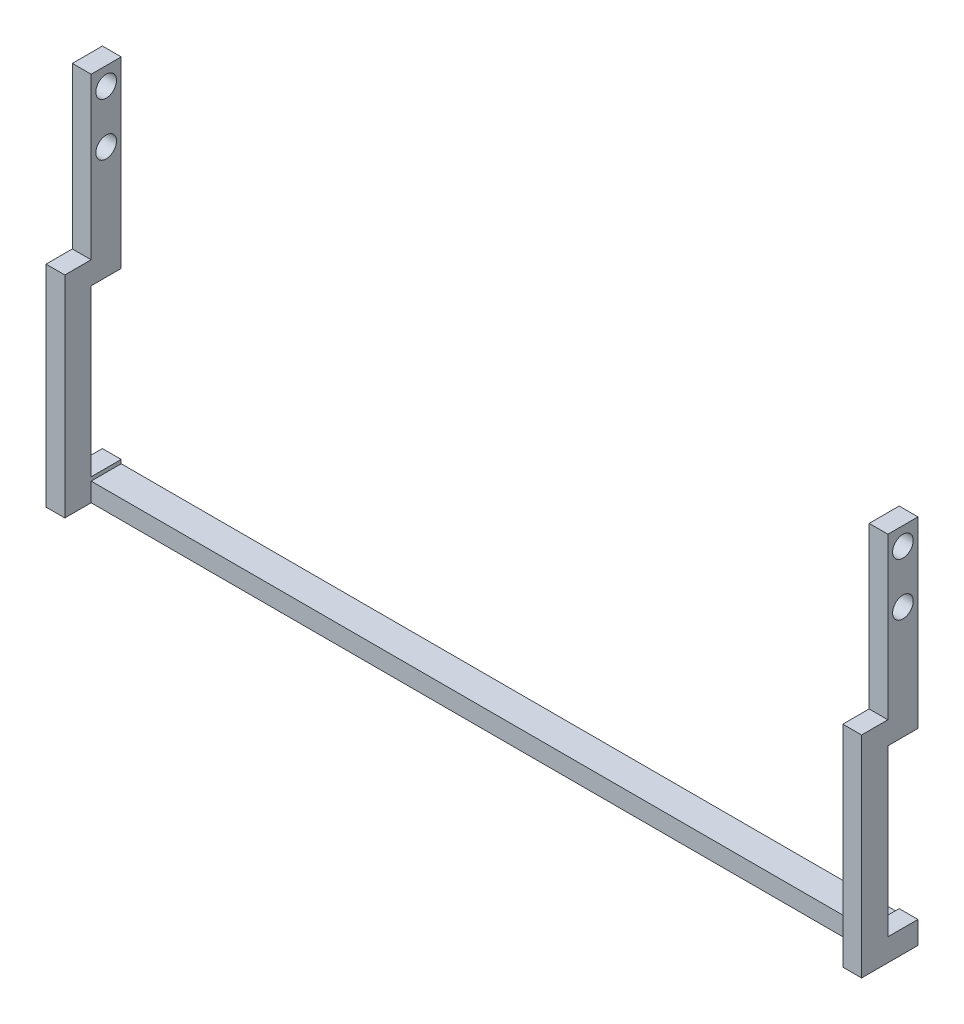
ISO-10303-21;
HEADER;
FILE_DESCRIPTION(('STEP AP214'),'2;1');
FILE_NAME('part.step','',(''),(''),'','','');
FILE_SCHEMA(('AUTOMOTIVE_DESIGN { 1 0 10303 214 1 1 1 1 }'));
ENDSEC;
DATA;
#1=APPLICATION_CONTEXT('core data for automotive mechanical design processes');
#2=APPLICATION_PROTOCOL_DEFINITION('international standard','automotive_design',2000,#1);
#3=PRODUCT_CONTEXT('',#1,'mechanical');
#4=PRODUCT('Part','Part','',(#3));
#5=PRODUCT_RELATED_PRODUCT_CATEGORY('part','',(#4));
#6=PRODUCT_DEFINITION_FORMATION('','',#4);
#7=PRODUCT_DEFINITION_CONTEXT('part definition',#1,'design');
#8=PRODUCT_DEFINITION('design','',#6,#7);
#9=PRODUCT_DEFINITION_SHAPE('','',#8);
#10=(LENGTH_UNIT() NAMED_UNIT(*) SI_UNIT(.MILLI.,.METRE.));
#11=(NAMED_UNIT(*) PLANE_ANGLE_UNIT() SI_UNIT($,.RADIAN.));
#12=(NAMED_UNIT(*) SI_UNIT($,.STERADIAN.) SOLID_ANGLE_UNIT());
#13=UNCERTAINTY_MEASURE_WITH_UNIT(LENGTH_MEASURE(1.E-05),#10,'distance_accuracy_value','');
#14=(GEOMETRIC_REPRESENTATION_CONTEXT(3) GLOBAL_UNCERTAINTY_ASSIGNED_CONTEXT((#13)) GLOBAL_UNIT_ASSIGNED_CONTEXT((#10,
#11,#12)) REPRESENTATION_CONTEXT('',''));
#15=CARTESIAN_POINT('',(0.,0.,0.));
#16=DIRECTION('',(0.,0.,1.));
#17=DIRECTION('',(1.,0.,0.));
#18=AXIS2_PLACEMENT_3D('',#15,#16,#17);
#19=CARTESIAN_POINT('',(1016.645,222.325841887961,59.6040827323368));
#20=DIRECTION('',(0.,0.,-1.));
#21=DIRECTION('',(-1.,0.,0.));
#22=AXIS2_PLACEMENT_3D('',#19,#20,#21);
#23=PLANE('',#22);
#24=DIRECTION('',(0.,1.,0.));
#25=VECTOR('',#24,1.);
#26=CARTESIAN_POINT('',(1153.355,222.325841887961,59.6040827323368));
#27=LINE('',#26,#25);
#28=CARTESIAN_POINT('',(1153.355,257.605841887961,59.6040827323368));
#29=VERTEX_POINT('',#28);
#30=CARTESIAN_POINT('',(1153.355,284.545841887961,59.6040827323368));
#31=VERTEX_POINT('',#30);
#32=EDGE_CURVE('E443',#29,#31,#27,.T.);
#33=ORIENTED_EDGE('',*,*,#32,.T.);
#34=DIRECTION('',(1.,0.,0.));
#35=VECTOR('',#34,1.);
#36=CARTESIAN_POINT('',(1016.645,284.545841887961,59.6040827323368));
#37=LINE('',#36,#35);
#38=CARTESIAN_POINT('',(1150.205,284.545841887961,59.6040827323368));
#39=VERTEX_POINT('',#38);
#40=EDGE_CURVE('E63',#39,#31,#37,.T.);
#41=ORIENTED_EDGE('',*,*,#40,.F.);
#42=DIRECTION('',(0.,-1.,0.));
#43=VECTOR('',#42,1.);
#44=CARTESIAN_POINT('',(1150.205,225.475841887961,59.6040827323368));
#45=LINE('',#44,#43);
#46=CARTESIAN_POINT('',(1150.205,257.605841887961,59.6040827323368));
#47=VERTEX_POINT('',#46);
#48=EDGE_CURVE('E447',#39,#47,#45,.T.);
#49=ORIENTED_EDGE('',*,*,#48,.T.);
#50=DIRECTION('',(-1.,0.,0.));
#51=VECTOR('',#50,1.);
#52=CARTESIAN_POINT('',(1150.205,257.605841887961,59.6040827323368));
#53=LINE('',#52,#51);
#54=EDGE_CURVE('E12',#29,#47,#53,.T.);
#55=ORIENTED_EDGE('',*,*,#54,.F.);
#56=EDGE_LOOP('',(#33,#41,#49,#55));
#57=FACE_BOUND('',#56,.T.);
#58=ADVANCED_FACE('F47',(#57),#23,.F.);
#59=CARTESIAN_POINT('',(1016.645,222.325841887961,54.5640827323368));
#60=DIRECTION('',(0.,0.,-1.));
#61=DIRECTION('',(-1.,0.,0.));
#62=AXIS2_PLACEMENT_3D('',#59,#60,#61);
#63=PLANE('',#62);
#64=DIRECTION('',(1.,0.,0.));
#65=VECTOR('',#64,1.);
#66=CARTESIAN_POINT('',(1016.645,284.545841887961,54.5640827323368));
#67=LINE('',#66,#65);
#68=CARTESIAN_POINT('',(1150.205,284.545841887961,54.5640827323368));
#69=VERTEX_POINT('',#68);
#70=CARTESIAN_POINT('',(1153.355,284.545841887961,54.5640827323368));
#71=VERTEX_POINT('',#70);
#72=EDGE_CURVE('E197',#69,#71,#67,.T.);
#73=ORIENTED_EDGE('',*,*,#72,.T.);
#74=DIRECTION('',(0.,1.,0.));
#75=VECTOR('',#74,1.);
#76=CARTESIAN_POINT('',(1153.355,253.825841887961,54.5640827323368));
#77=LINE('',#76,#75);
#78=CARTESIAN_POINT('',(1153.355,253.825841887961,54.5640827323368));
#79=VERTEX_POINT('',#78);
#80=EDGE_CURVE('E211',#79,#71,#77,.T.);
#81=ORIENTED_EDGE('',*,*,#80,.F.);
#82=DIRECTION('',(1.,0.,0.));
#83=VECTOR('',#82,1.);
#84=CARTESIAN_POINT('',(1150.205,253.825841887961,54.5640827323368));
#85=LINE('',#84,#83);
#86=CARTESIAN_POINT('',(1150.205,253.825841887961,54.5640827323368));
#87=VERTEX_POINT('',#86);
#88=EDGE_CURVE('E246',#87,#79,#85,.T.);
#89=ORIENTED_EDGE('',*,*,#88,.F.);
#90=DIRECTION('',(0.,1.,0.));
#91=VECTOR('',#90,1.);
#92=CARTESIAN_POINT('',(1150.205,253.825841887961,54.5640827323368));
#93=LINE('',#92,#91);
#94=EDGE_CURVE('E214',#87,#69,#93,.T.);
#95=ORIENTED_EDGE('',*,*,#94,.T.);
#96=EDGE_LOOP('',(#73,#81,#89,#95));
#97=FACE_BOUND('',#96,.T.);
#98=ADVANCED_FACE('F210',(#97),#63,.T.);
#99=CARTESIAN_POINT('',(1150.205,257.605841887961,54.5640827323368));
#100=DIRECTION('',(0.,1.,0.));
#101=DIRECTION('',(0.,0.,1.));
#102=AXIS2_PLACEMENT_3D('',#99,#100,#101);
#103=PLANE('',#102);
#104=DIRECTION('',(0.,0.,1.));
#105=VECTOR('',#104,1.);
#106=CARTESIAN_POINT('',(1153.355,257.605841887961,54.5640827323368));
#107=LINE('',#106,#105);
#108=CARTESIAN_POINT('',(1153.355,257.605841887961,64.0140827323368));
#109=VERTEX_POINT('',#108);
#110=EDGE_CURVE('E224',#29,#109,#107,.T.);
#111=ORIENTED_EDGE('',*,*,#110,.F.);
#112=ORIENTED_EDGE('',*,*,#54,.T.);
#113=DIRECTION('',(0.,0.,1.));
#114=VECTOR('',#113,1.);
#115=CARTESIAN_POINT('',(1150.205,257.605841887961,54.5640827323368));
#116=LINE('',#115,#114);
#117=CARTESIAN_POINT('',(1150.205,257.605841887961,64.0140827323368));
#118=VERTEX_POINT('',#117);
#119=EDGE_CURVE('E437',#47,#118,#116,.T.);
#120=ORIENTED_EDGE('',*,*,#119,.T.);
#121=DIRECTION('',(1.,0.,0.));
#122=VECTOR('',#121,1.);
#123=CARTESIAN_POINT('',(1150.205,257.605841887961,64.0140827323368));
#124=LINE('',#123,#122);
#125=EDGE_CURVE('E257',#118,#109,#124,.T.);
#126=ORIENTED_EDGE('',*,*,#125,.T.);
#127=EDGE_LOOP('',(#111,#112,#120,#126));
#128=FACE_BOUND('',#127,.T.);
#129=ADVANCED_FACE('F525',(#128),#103,.T.);
#130=DIRECTION('',(0.,-1.,0.));
#131=VECTOR('',#130,1.);
#132=CARTESIAN_POINT('',(1150.205,222.325841887961,59.6040827323368));
#133=LINE('',#132,#131);
#134=CARTESIAN_POINT('',(1150.205,225.475841887961,59.6040827323368));
#135=VERTEX_POINT('',#134);
#136=CARTESIAN_POINT('',(1150.205,222.325841887961,59.6040827323368));
#137=VERTEX_POINT('',#136);
#138=EDGE_CURVE('E249',#135,#137,#133,.T.);
#139=ORIENTED_EDGE('',*,*,#138,.F.);
#140=DIRECTION('',(-1.,0.,0.));
#141=VECTOR('',#140,1.);
#142=CARTESIAN_POINT('',(1019.795,225.475841887961,59.6040827323368));
#143=LINE('',#142,#141);
#144=CARTESIAN_POINT('',(1019.795,225.475841887961,59.6040827323368));
#145=VERTEX_POINT('',#144);
#146=EDGE_CURVE('E353',#135,#145,#143,.T.);
#147=ORIENTED_EDGE('',*,*,#146,.T.);
#148=DIRECTION('',(0.,1.,0.));
#149=VECTOR('',#148,1.);
#150=CARTESIAN_POINT('',(1019.795,222.325841887961,59.6040827323368));
#151=LINE('',#150,#149);
#152=CARTESIAN_POINT('',(1019.795,222.325841887961,59.6040827323368));
#153=VERTEX_POINT('',#152);
#154=EDGE_CURVE('E316',#153,#145,#151,.T.);
#155=ORIENTED_EDGE('',*,*,#154,.F.);
#156=DIRECTION('',(1.,0.,0.));
#157=VECTOR('',#156,1.);
#158=CARTESIAN_POINT('',(1016.645,222.325841887961,59.6040827323368));
#159=LINE('',#158,#157);
#160=EDGE_CURVE('E349',#153,#137,#159,.T.);
#161=ORIENTED_EDGE('',*,*,#160,.T.);
#162=EDGE_LOOP('',(#139,#147,#155,#161));
#163=FACE_BOUND('',#162,.T.);
#164=ADVANCED_FACE('F520',(#163),#23,.F.);
#165=CARTESIAN_POINT('',(1019.795,222.325841887961,64.0140827323368));
#166=DIRECTION('',(0.,0.,1.));
#167=DIRECTION('',(1.,0.,0.));
#168=AXIS2_PLACEMENT_3D('',#165,#166,#167);
#169=PLANE('',#168);
#170=DIRECTION('',(0.,1.,0.));
#171=VECTOR('',#170,1.);
#172=CARTESIAN_POINT('',(1016.645,222.325841887961,64.0140827323368));
#173=LINE('',#172,#171);
#174=CARTESIAN_POINT('',(1016.645,222.325841887961,64.0140827323368));
#175=VERTEX_POINT('',#174);
#176=CARTESIAN_POINT('',(1016.645,257.605841887961,64.0140827323368));
#177=VERTEX_POINT('',#176);
#178=EDGE_CURVE('E303',#175,#177,#173,.T.);
#179=ORIENTED_EDGE('',*,*,#178,.F.);
#180=DIRECTION('',(-1.,0.,0.));
#181=VECTOR('',#180,1.);
#182=CARTESIAN_POINT('',(1019.795,222.325841887961,64.0140827323368));
#183=LINE('',#182,#181);
#184=CARTESIAN_POINT('',(1019.795,222.325841887961,64.0140827323368));
#185=VERTEX_POINT('',#184);
#186=EDGE_CURVE('E320',#185,#175,#183,.T.);
#187=ORIENTED_EDGE('',*,*,#186,.F.);
#188=DIRECTION('',(0.,1.,0.));
#189=VECTOR('',#188,1.);
#190=CARTESIAN_POINT('',(1019.795,222.325841887961,64.0140827323368));
#191=LINE('',#190,#189);
#192=CARTESIAN_POINT('',(1019.795,257.605841887961,64.0140827323368));
#193=VERTEX_POINT('',#192);
#194=EDGE_CURVE('E308',#185,#193,#191,.T.);
#195=ORIENTED_EDGE('',*,*,#194,.T.);
#196=DIRECTION('',(-1.,0.,0.));
#197=VECTOR('',#196,1.);
#198=CARTESIAN_POINT('',(1019.795,257.605841887961,64.0140827323368));
#199=LINE('',#198,#197);
#200=EDGE_CURVE('E332',#193,#177,#199,.T.);
#201=ORIENTED_EDGE('',*,*,#200,.T.);
#202=EDGE_LOOP('',(#179,#187,#195,#201));
#203=FACE_BOUND('',#202,.T.);
#204=ADVANCED_FACE('F491',(#203),#169,.T.);
#205=CARTESIAN_POINT('',(1019.795,257.605841887961,54.5640827323369));
#206=DIRECTION('',(0.,-1.,0.));
#207=DIRECTION('',(0.,0.,-1.));
#208=AXIS2_PLACEMENT_3D('',#205,#206,#207);
#209=PLANE('',#208);
#210=DIRECTION('',(0.,0.,1.));
#211=VECTOR('',#210,1.);
#212=CARTESIAN_POINT('',(1016.645,257.605841887961,54.5640827323369));
#213=LINE('',#212,#211);
#214=CARTESIAN_POINT('',(1016.645,257.605841887961,59.6040827323368));
#215=VERTEX_POINT('',#214);
#216=EDGE_CURVE('E309',#215,#177,#213,.T.);
#217=ORIENTED_EDGE('',*,*,#216,.T.);
#218=ORIENTED_EDGE('',*,*,#200,.F.);
#219=DIRECTION('',(0.,0.,1.));
#220=VECTOR('',#219,1.);
#221=CARTESIAN_POINT('',(1019.795,257.605841887961,54.5640827323369));
#222=LINE('',#221,#220);
#223=CARTESIAN_POINT('',(1019.795,257.605841887961,59.6040827323368));
#224=VERTEX_POINT('',#223);
#225=EDGE_CURVE('E313',#224,#193,#222,.T.);
#226=ORIENTED_EDGE('',*,*,#225,.F.);
#227=DIRECTION('',(-1.,0.,0.));
#228=VECTOR('',#227,1.);
#229=CARTESIAN_POINT('',(1019.795,257.605841887961,59.6040827323368));
#230=LINE('',#229,#228);
#231=EDGE_CURVE('E327',#224,#215,#230,.T.);
#232=ORIENTED_EDGE('',*,*,#231,.T.);
#233=EDGE_LOOP('',(#217,#218,#226,#232));
#234=FACE_BOUND('',#233,.T.);
#235=ADVANCED_FACE('F495',(#234),#209,.F.);
#236=DIRECTION('',(0.,1.,0.));
#237=VECTOR('',#236,1.);
#238=CARTESIAN_POINT('',(1019.795,284.695841887961,59.6040827323368));
#239=LINE('',#238,#237);
#240=CARTESIAN_POINT('',(1019.795,284.545841887961,59.6040827323368));
#241=VERTEX_POINT('',#240);
#242=EDGE_CURVE('E356',#224,#241,#239,.T.);
#243=ORIENTED_EDGE('',*,*,#242,.T.);
#244=CARTESIAN_POINT('',(1016.645,284.545841887961,59.6040827323368));
#245=VERTEX_POINT('',#244);
#246=EDGE_CURVE('E216',#245,#241,#37,.T.);
#247=ORIENTED_EDGE('',*,*,#246,.F.);
#248=DIRECTION('',(0.,-1.,0.));
#249=VECTOR('',#248,1.);
#250=CARTESIAN_POINT('',(1016.645,222.325841887961,59.6040827323368));
#251=LINE('',#250,#249);
#252=EDGE_CURVE('E346',#245,#215,#251,.T.);
#253=ORIENTED_EDGE('',*,*,#252,.T.);
#254=ORIENTED_EDGE('',*,*,#231,.F.);
#255=EDGE_LOOP('',(#243,#247,#253,#254));
#256=FACE_BOUND('',#255,.T.);
#257=ADVANCED_FACE('F499',(#256),#23,.F.);
#258=CARTESIAN_POINT('',(1153.355,272.725841887961,57.0840827323368));
#259=DIRECTION('',(-1.,0.,0.));
#260=DIRECTION('',(0.,0.,1.));
#261=AXIS2_PLACEMENT_3D('',#258,#259,#260);
#262=CYLINDRICAL_SURFACE('',#261,1.7325);
#263=CARTESIAN_POINT('',(1016.645,272.725841887961,57.0840827323368));
#264=DIRECTION('',(-1.,0.,0.));
#265=DIRECTION('',(0.,0.,1.));
#266=AXIS2_PLACEMENT_3D('',#263,#264,#265);
#267=CIRCLE('',#266,1.7325);
#268=CARTESIAN_POINT('',(1016.645,272.725841887961,58.8165827323368));
#269=VERTEX_POINT('',#268);
#270=EDGE_CURVE('E331',#269,#269,#267,.T.);
#271=ORIENTED_EDGE('',*,*,#270,.T.);
#272=EDGE_LOOP('',(#271));
#273=FACE_BOUND('',#272,.T.);
#274=CARTESIAN_POINT('',(1019.795,272.725841887961,57.0840827323368));
#275=DIRECTION('',(-1.,0.,0.));
#276=DIRECTION('',(0.,-1.,0.));
#277=AXIS2_PLACEMENT_3D('',#274,#275,#276);
#278=CIRCLE('',#277,1.7325);
#279=CARTESIAN_POINT('',(1019.795,270.993341887961,57.0840827323368));
#280=VERTEX_POINT('',#279);
#281=EDGE_CURVE('E342',#280,#280,#278,.T.);
#282=ORIENTED_EDGE('',*,*,#281,.F.);
#283=EDGE_LOOP('',(#282));
#284=FACE_BOUND('',#283,.T.);
#285=ADVANCED_FACE('F531',(#273,#284),#262,.F.);
#286=CARTESIAN_POINT('',(1153.355,281.545841887961,57.0840827323368));
#287=DIRECTION('',(-1.,0.,0.));
#288=DIRECTION('',(0.,0.,1.));
#289=AXIS2_PLACEMENT_3D('',#286,#287,#288);
#290=CYLINDRICAL_SURFACE('',#289,1.7325);
#291=CARTESIAN_POINT('',(1016.645,281.545841887961,57.0840827323368));
#292=DIRECTION('',(-1.,0.,0.));
#293=DIRECTION('',(0.,0.,1.));
#294=AXIS2_PLACEMENT_3D('',#291,#292,#293);
#295=CIRCLE('',#294,1.7325);
#296=CARTESIAN_POINT('',(1016.645,281.545841887961,58.8165827323368));
#297=VERTEX_POINT('',#296);
#298=EDGE_CURVE('E338',#297,#297,#295,.T.);
#299=ORIENTED_EDGE('',*,*,#298,.T.);
#300=EDGE_LOOP('',(#299));
#301=FACE_BOUND('',#300,.T.);
#302=CARTESIAN_POINT('',(1019.795,281.545841887961,57.0840827323368));
#303=DIRECTION('',(-1.,0.,0.));
#304=DIRECTION('',(0.,-1.,0.));
#305=AXIS2_PLACEMENT_3D('',#302,#303,#304);
#306=CIRCLE('',#305,1.7325);
#307=CARTESIAN_POINT('',(1019.795,279.813341887961,57.0840827323368));
#308=VERTEX_POINT('',#307);
#309=EDGE_CURVE('E401',#308,#308,#306,.T.);
#310=ORIENTED_EDGE('',*,*,#309,.F.);
#311=EDGE_LOOP('',(#310));
#312=FACE_BOUND('',#311,.T.);
#313=ADVANCED_FACE('F536',(#301,#312),#290,.F.);
#314=CARTESIAN_POINT('',(1019.795,225.475841887961,59.6040827323368));
#315=DIRECTION('',(0.,-1.,0.));
#316=DIRECTION('',(0.,0.,-1.));
#317=AXIS2_PLACEMENT_3D('',#314,#315,#316);
#318=PLANE('',#317);
#319=DIRECTION('',(-1.,0.,0.));
#320=VECTOR('',#319,1.);
#321=CARTESIAN_POINT('',(1019.795,225.475841887961,54.5640827323368));
#322=LINE('',#321,#320);
#323=CARTESIAN_POINT('',(1150.205,225.475841887961,54.5640827323368));
#324=VERTEX_POINT('',#323);
#325=CARTESIAN_POINT('',(1019.795,225.475841887961,54.5640827323368));
#326=VERTEX_POINT('',#325);
#327=EDGE_CURVE('E375',#324,#326,#322,.T.);
#328=ORIENTED_EDGE('',*,*,#327,.T.);
#329=DIRECTION('',(0.,0.,-1.));
#330=VECTOR('',#329,1.);
#331=CARTESIAN_POINT('',(1019.795,225.475841887961,59.6040827323368));
#332=LINE('',#331,#330);
#333=EDGE_CURVE('E360',#145,#326,#332,.T.);
#334=ORIENTED_EDGE('',*,*,#333,.F.);
#335=ORIENTED_EDGE('',*,*,#146,.F.);
#336=DIRECTION('',(0.,0.,-1.));
#337=VECTOR('',#336,1.);
#338=CARTESIAN_POINT('',(1150.205,225.475841887961,59.6040827323368));
#339=LINE('',#338,#337);
#340=EDGE_CURVE('E385',#135,#324,#339,.T.);
#341=ORIENTED_EDGE('',*,*,#340,.T.);
#342=EDGE_LOOP('',(#328,#334,#335,#341));
#343=FACE_BOUND('',#342,.T.);
#344=ADVANCED_FACE('F546',(#343),#318,.F.);
#345=CARTESIAN_POINT('',(1016.645,222.325841887961,59.6040827323368));
#346=DIRECTION('',(0.,1.,0.));
#347=DIRECTION('',(0.,0.,1.));
#348=AXIS2_PLACEMENT_3D('',#345,#346,#347);
#349=PLANE('',#348);
#350=DIRECTION('',(0.,0.,-1.));
#351=VECTOR('',#350,1.);
#352=CARTESIAN_POINT('',(1153.355,222.325841887961,59.6040827323368));
#353=LINE('',#352,#351);
#354=CARTESIAN_POINT('',(1153.355,222.325841887961,64.0140827323368));
#355=VERTEX_POINT('',#354);
#356=CARTESIAN_POINT('',(1153.355,222.325841887961,54.5640827323368));
#357=VERTEX_POINT('',#356);
#358=EDGE_CURVE('E389',#355,#357,#353,.T.);
#359=ORIENTED_EDGE('',*,*,#358,.F.);
#360=DIRECTION('',(1.,0.,0.));
#361=VECTOR('',#360,1.);
#362=CARTESIAN_POINT('',(1150.205,222.325841887961,64.0140827323368));
#363=LINE('',#362,#361);
#364=CARTESIAN_POINT('',(1150.205,222.325841887961,64.0140827323368));
#365=VERTEX_POINT('',#364);
#366=EDGE_CURVE('E253',#365,#355,#363,.T.);
#367=ORIENTED_EDGE('',*,*,#366,.F.);
#368=DIRECTION('',(0.,0.,-1.));
#369=VECTOR('',#368,1.);
#370=CARTESIAN_POINT('',(1150.205,222.325841887961,64.0140827323368));
#371=LINE('',#370,#369);
#372=EDGE_CURVE('E431',#365,#137,#371,.T.);
#373=ORIENTED_EDGE('',*,*,#372,.T.);
#374=ORIENTED_EDGE('',*,*,#160,.F.);
#375=DIRECTION('',(0.,0.,1.));
#376=VECTOR('',#375,1.);
#377=CARTESIAN_POINT('',(1019.795,222.325841887961,54.5640827323368));
#378=LINE('',#377,#376);
#379=EDGE_CURVE('E304',#153,#185,#378,.T.);
#380=ORIENTED_EDGE('',*,*,#379,.T.);
#381=ORIENTED_EDGE('',*,*,#186,.T.);
#382=DIRECTION('',(0.,0.,-1.));
#383=VECTOR('',#382,1.);
#384=CARTESIAN_POINT('',(1016.645,222.325841887961,59.6040827323368));
#385=LINE('',#384,#383);
#386=CARTESIAN_POINT('',(1016.645,222.325841887961,54.5640827323368));
#387=VERTEX_POINT('',#386);
#388=EDGE_CURVE('E393',#175,#387,#385,.T.);
#389=ORIENTED_EDGE('',*,*,#388,.T.);
#390=DIRECTION('',(1.,0.,0.));
#391=VECTOR('',#390,1.);
#392=CARTESIAN_POINT('',(1016.645,222.325841887961,54.5640827323368));
#393=LINE('',#392,#391);
#394=EDGE_CURVE('E364',#387,#357,#393,.T.);
#395=ORIENTED_EDGE('',*,*,#394,.T.);
#396=EDGE_LOOP('',(#359,#367,#373,#374,#380,#381,#389,#395));
#397=FACE_BOUND('',#396,.T.);
#398=ADVANCED_FACE('F485',(#397),#349,.F.);
#399=DIRECTION('',(0.,1.,0.));
#400=VECTOR('',#399,1.);
#401=CARTESIAN_POINT('',(1153.355,222.325841887961,54.5640827323368));
#402=LINE('',#401,#400);
#403=CARTESIAN_POINT('',(1153.355,226.105841887961,54.5640827323368));
#404=VERTEX_POINT('',#403);
#405=EDGE_CURVE('E368',#357,#404,#402,.T.);
#406=ORIENTED_EDGE('',*,*,#405,.F.);
#407=ORIENTED_EDGE('',*,*,#394,.F.);
#408=DIRECTION('',(0.,-1.,0.));
#409=VECTOR('',#408,1.);
#410=CARTESIAN_POINT('',(1016.645,222.325841887961,54.5640827323368));
#411=LINE('',#410,#409);
#412=CARTESIAN_POINT('',(1016.645,226.105841887961,54.5640827323368));
#413=VERTEX_POINT('',#412);
#414=EDGE_CURVE('E365',#413,#387,#411,.T.);
#415=ORIENTED_EDGE('',*,*,#414,.F.);
#416=DIRECTION('',(-1.,0.,0.));
#417=VECTOR('',#416,1.);
#418=CARTESIAN_POINT('',(1016.645,226.105841887961,54.5640827323368));
#419=LINE('',#418,#417);
#420=CARTESIAN_POINT('',(1019.795,226.105841887961,54.5640827323368));
#421=VERTEX_POINT('',#420);
#422=EDGE_CURVE('E397',#421,#413,#419,.T.);
#423=ORIENTED_EDGE('',*,*,#422,.F.);
#424=DIRECTION('',(0.,1.,0.));
#425=VECTOR('',#424,1.);
#426=CARTESIAN_POINT('',(1019.795,284.695841887961,54.5640827323368));
#427=LINE('',#426,#425);
#428=EDGE_CURVE('E350',#326,#421,#427,.T.);
#429=ORIENTED_EDGE('',*,*,#428,.F.);
#430=ORIENTED_EDGE('',*,*,#327,.F.);
#431=DIRECTION('',(0.,-1.,0.));
#432=VECTOR('',#431,1.);
#433=CARTESIAN_POINT('',(1150.205,225.475841887961,54.5640827323368));
#434=LINE('',#433,#432);
#435=CARTESIAN_POINT('',(1150.205,226.105841887961,54.5640827323368));
#436=VERTEX_POINT('',#435);
#437=EDGE_CURVE('E372',#436,#324,#434,.T.);
#438=ORIENTED_EDGE('',*,*,#437,.F.);
#439=DIRECTION('',(-1.,0.,0.));
#440=VECTOR('',#439,1.);
#441=CARTESIAN_POINT('',(1153.355,226.105841887961,54.5640827323368));
#442=LINE('',#441,#440);
#443=EDGE_CURVE('E269',#404,#436,#442,.T.);
#444=ORIENTED_EDGE('',*,*,#443,.F.);
#445=EDGE_LOOP('',(#406,#407,#415,#423,#429,#430,#438,#444));
#446=FACE_BOUND('',#445,.T.);
#447=ADVANCED_FACE('F482',(#446),#63,.T.);
#448=CARTESIAN_POINT('',(1016.645,284.545841887961,54.5640827323368));
#449=VERTEX_POINT('',#448);
#450=CARTESIAN_POINT('',(1019.795,284.545841887961,54.5640827323368));
#451=VERTEX_POINT('',#450);
#452=EDGE_CURVE('E71',#449,#451,#67,.T.);
#453=ORIENTED_EDGE('',*,*,#452,.T.);
#454=CARTESIAN_POINT('',(1019.795,253.825841887961,54.5640827323368));
#455=VERTEX_POINT('',#454);
#456=EDGE_CURVE('E378',#455,#451,#427,.T.);
#457=ORIENTED_EDGE('',*,*,#456,.F.);
#458=DIRECTION('',(1.,0.,0.));
#459=VECTOR('',#458,1.);
#460=CARTESIAN_POINT('',(1016.645,253.825841887961,54.5640827323368));
#461=LINE('',#460,#459);
#462=CARTESIAN_POINT('',(1016.645,253.825841887961,54.5640827323368));
#463=VERTEX_POINT('',#462);
#464=EDGE_CURVE('E407',#463,#455,#461,.T.);
#465=ORIENTED_EDGE('',*,*,#464,.F.);
#466=EDGE_CURVE('E361',#449,#463,#411,.T.);
#467=ORIENTED_EDGE('',*,*,#466,.F.);
#468=EDGE_LOOP('',(#453,#457,#465,#467));
#469=FACE_BOUND('',#468,.T.);
#470=ADVANCED_FACE('F472',(#469),#63,.T.);
#471=CARTESIAN_POINT('',(1019.795,284.695841887961,59.6040827323368));
#472=DIRECTION('',(-1.,0.,0.));
#473=DIRECTION('',(0.,-1.,0.));
#474=AXIS2_PLACEMENT_3D('',#471,#472,#473);
#475=PLANE('',#474);
#476=ORIENTED_EDGE('',*,*,#309,.T.);
#477=EDGE_LOOP('',(#476));
#478=FACE_BOUND('',#477,.T.);
#479=ORIENTED_EDGE('',*,*,#281,.T.);
#480=EDGE_LOOP('',(#479));
#481=FACE_BOUND('',#480,.T.);
#482=ORIENTED_EDGE('',*,*,#456,.T.);
#483=DIRECTION('',(0.,0.,1.));
#484=VECTOR('',#483,1.);
#485=CARTESIAN_POINT('',(1019.795,284.545841887961,59.6040827323368));
#486=LINE('',#485,#484);
#487=EDGE_CURVE('E450',#451,#241,#486,.T.);
#488=ORIENTED_EDGE('',*,*,#487,.T.);
#489=ORIENTED_EDGE('',*,*,#242,.F.);
#490=ORIENTED_EDGE('',*,*,#225,.T.);
#491=ORIENTED_EDGE('',*,*,#194,.F.);
#492=ORIENTED_EDGE('',*,*,#379,.F.);
#493=ORIENTED_EDGE('',*,*,#154,.T.);
#494=ORIENTED_EDGE('',*,*,#333,.T.);
#495=ORIENTED_EDGE('',*,*,#428,.T.);
#496=DIRECTION('',(0.,0.,1.));
#497=VECTOR('',#496,1.);
#498=CARTESIAN_POINT('',(1019.795,226.105841887961,59.6040827323368));
#499=LINE('',#498,#497);
#500=CARTESIAN_POINT('',(1019.795,226.105841887961,59.6040827323368));
#501=VERTEX_POINT('',#500);
#502=EDGE_CURVE('E284',#421,#501,#499,.T.);
#503=ORIENTED_EDGE('',*,*,#502,.T.);
#504=DIRECTION('',(0.,1.,0.));
#505=VECTOR('',#504,1.);
#506=CARTESIAN_POINT('',(1019.795,284.695841887961,59.6040827323368));
#507=LINE('',#506,#505);
#508=CARTESIAN_POINT('',(1019.795,253.825841887961,59.6040827323368));
#509=VERTEX_POINT('',#508);
#510=EDGE_CURVE('E56',#501,#509,#507,.T.);
#511=ORIENTED_EDGE('',*,*,#510,.T.);
#512=DIRECTION('',(0.,0.,-1.));
#513=VECTOR('',#512,1.);
#514=CARTESIAN_POINT('',(1019.795,253.825841887961,59.6040827323368));
#515=LINE('',#514,#513);
#516=EDGE_CURVE('E299',#509,#455,#515,.T.);
#517=ORIENTED_EDGE('',*,*,#516,.T.);
#518=EDGE_LOOP('',(#482,#488,#489,#490,#491,#492,#493,#494,#495,#503,#511,#517));
#519=FACE_BOUND('',#518,.T.);
#520=ADVANCED_FACE('F413',(#478,#481,#519),#475,.F.);
#521=CARTESIAN_POINT('',(1150.205,225.475841887961,59.6040827323368));
#522=DIRECTION('',(1.,0.,0.));
#523=DIRECTION('',(0.,0.,-1.));
#524=AXIS2_PLACEMENT_3D('',#521,#522,#523);
#525=PLANE('',#524);
#526=ORIENTED_EDGE('',*,*,#48,.F.);
#527=DIRECTION('',(0.,0.,-1.));
#528=VECTOR('',#527,1.);
#529=CARTESIAN_POINT('',(1150.205,284.545841887961,59.6040827323368));
#530=LINE('',#529,#528);
#531=EDGE_CURVE('E204',#39,#69,#530,.T.);
#532=ORIENTED_EDGE('',*,*,#531,.T.);
#533=ORIENTED_EDGE('',*,*,#94,.F.);
#534=DIRECTION('',(0.,0.,-1.));
#535=VECTOR('',#534,1.);
#536=CARTESIAN_POINT('',(1150.205,253.825841887961,54.5640827323368));
#537=LINE('',#536,#535);
#538=CARTESIAN_POINT('',(1150.205,253.825841887961,59.6040827323368));
#539=VERTEX_POINT('',#538);
#540=EDGE_CURVE('E235',#539,#87,#537,.T.);
#541=ORIENTED_EDGE('',*,*,#540,.F.);
#542=DIRECTION('',(0.,1.,0.));
#543=VECTOR('',#542,1.);
#544=CARTESIAN_POINT('',(1150.205,253.825841887961,59.6040827323368));
#545=LINE('',#544,#543);
#546=CARTESIAN_POINT('',(1150.205,226.105841887961,59.6040827323368));
#547=VERTEX_POINT('',#546);
#548=EDGE_CURVE('E428',#547,#539,#545,.T.);
#549=ORIENTED_EDGE('',*,*,#548,.F.);
#550=DIRECTION('',(0.,0.,-1.));
#551=VECTOR('',#550,1.);
#552=CARTESIAN_POINT('',(1150.205,226.105841887961,59.6040827323368));
#553=LINE('',#552,#551);
#554=EDGE_CURVE('E295',#547,#436,#553,.T.);
#555=ORIENTED_EDGE('',*,*,#554,.T.);
#556=ORIENTED_EDGE('',*,*,#437,.T.);
#557=ORIENTED_EDGE('',*,*,#340,.F.);
#558=ORIENTED_EDGE('',*,*,#138,.T.);
#559=ORIENTED_EDGE('',*,*,#372,.F.);
#560=DIRECTION('',(0.,-1.,0.));
#561=VECTOR('',#560,1.);
#562=CARTESIAN_POINT('',(1150.205,257.605841887961,64.0140827323368));
#563=LINE('',#562,#561);
#564=EDGE_CURVE('E434',#118,#365,#563,.T.);
#565=ORIENTED_EDGE('',*,*,#564,.F.);
#566=ORIENTED_EDGE('',*,*,#119,.F.);
#567=EDGE_LOOP('',(#526,#532,#533,#541,#549,#555,#556,#557,#558,#559,#565,#566));
#568=FACE_BOUND('',#567,.T.);
#569=CARTESIAN_POINT('',(1150.205,272.725841887961,57.0840827323368));
#570=DIRECTION('',(1.,0.,0.));
#571=DIRECTION('',(0.,0.,-1.));
#572=AXIS2_PLACEMENT_3D('',#569,#570,#571);
#573=CIRCLE('',#572,1.7325);
#574=CARTESIAN_POINT('',(1150.205,272.725841887961,55.3515827323368));
#575=VERTEX_POINT('',#574);
#576=EDGE_CURVE('E232',#575,#575,#573,.T.);
#577=ORIENTED_EDGE('',*,*,#576,.T.);
#578=EDGE_LOOP('',(#577));
#579=FACE_BOUND('',#578,.T.);
#580=CARTESIAN_POINT('',(1150.205,281.545841887961,57.0840827323368));
#581=DIRECTION('',(1.,0.,0.));
#582=DIRECTION('',(0.,0.,-1.));
#583=AXIS2_PLACEMENT_3D('',#580,#581,#582);
#584=CIRCLE('',#583,1.7325);
#585=CARTESIAN_POINT('',(1150.205,281.545841887961,55.3515827323368));
#586=VERTEX_POINT('',#585);
#587=EDGE_CURVE('E225',#586,#586,#584,.T.);
#588=ORIENTED_EDGE('',*,*,#587,.T.);
#589=EDGE_LOOP('',(#588));
#590=FACE_BOUND('',#589,.T.);
#591=ADVANCED_FACE('F559',(#568,#579,#590),#525,.F.);
#592=CARTESIAN_POINT('',(1153.355,222.325841887961,59.6040827323368));
#593=DIRECTION('',(-1.,0.,0.));
#594=DIRECTION('',(0.,0.,1.));
#595=AXIS2_PLACEMENT_3D('',#592,#593,#594);
#596=PLANE('',#595);
#597=ORIENTED_EDGE('',*,*,#80,.T.);
#598=DIRECTION('',(0.,0.,1.));
#599=VECTOR('',#598,1.);
#600=CARTESIAN_POINT('',(1153.355,284.545841887961,54.5640827323368));
#601=LINE('',#600,#599);
#602=EDGE_CURVE('E194',#71,#31,#601,.T.);
#603=ORIENTED_EDGE('',*,*,#602,.T.);
#604=ORIENTED_EDGE('',*,*,#32,.F.);
#605=ORIENTED_EDGE('',*,*,#110,.T.);
#606=DIRECTION('',(0.,-1.,0.));
#607=VECTOR('',#606,1.);
#608=CARTESIAN_POINT('',(1153.355,225.475841887961,64.0140827323368));
#609=LINE('',#608,#607);
#610=EDGE_CURVE('E229',#109,#355,#609,.T.);
#611=ORIENTED_EDGE('',*,*,#610,.T.);
#612=ORIENTED_EDGE('',*,*,#358,.T.);
#613=ORIENTED_EDGE('',*,*,#405,.T.);
#614=DIRECTION('',(0.,0.,1.));
#615=VECTOR('',#614,1.);
#616=CARTESIAN_POINT('',(1153.355,226.105841887961,54.5640827323368));
#617=LINE('',#616,#615);
#618=CARTESIAN_POINT('',(1153.355,226.105841887961,59.6040827323368));
#619=VERTEX_POINT('',#618);
#620=EDGE_CURVE('E265',#404,#619,#617,.T.);
#621=ORIENTED_EDGE('',*,*,#620,.T.);
#622=DIRECTION('',(0.,1.,0.));
#623=VECTOR('',#622,1.);
#624=CARTESIAN_POINT('',(1153.355,253.825841887961,59.6040827323368));
#625=LINE('',#624,#623);
#626=CARTESIAN_POINT('',(1153.355,253.825841887961,59.6040827323368));
#627=VERTEX_POINT('',#626);
#628=EDGE_CURVE('E241',#619,#627,#625,.T.);
#629=ORIENTED_EDGE('',*,*,#628,.T.);
#630=DIRECTION('',(0.,0.,-1.));
#631=VECTOR('',#630,1.);
#632=CARTESIAN_POINT('',(1153.355,253.825841887961,54.5640827323368));
#633=LINE('',#632,#631);
#634=EDGE_CURVE('E222',#627,#79,#633,.T.);
#635=ORIENTED_EDGE('',*,*,#634,.T.);
#636=EDGE_LOOP('',(#597,#603,#604,#605,#611,#612,#613,#621,#629,#635));
#637=FACE_BOUND('',#636,.T.);
#638=CARTESIAN_POINT('',(1153.355,272.725841887961,57.0840827323368));
#639=DIRECTION('',(-1.,0.,0.));
#640=DIRECTION('',(0.,0.,1.));
#641=AXIS2_PLACEMENT_3D('',#638,#639,#640);
#642=CIRCLE('',#641,1.7325);
#643=CARTESIAN_POINT('',(1153.355,272.725841887961,58.8165827323368));
#644=VERTEX_POINT('',#643);
#645=EDGE_CURVE('E446',#644,#644,#642,.T.);
#646=ORIENTED_EDGE('',*,*,#645,.T.);
#647=EDGE_LOOP('',(#646));
#648=FACE_BOUND('',#647,.T.);
#649=CARTESIAN_POINT('',(1153.355,281.545841887961,57.0840827323368));
#650=DIRECTION('',(-1.,0.,0.));
#651=DIRECTION('',(0.,0.,1.));
#652=AXIS2_PLACEMENT_3D('',#649,#650,#651);
#653=CIRCLE('',#652,1.7325);
#654=CARTESIAN_POINT('',(1153.355,281.545841887961,58.8165827323368));
#655=VERTEX_POINT('',#654);
#656=EDGE_CURVE('E451',#655,#655,#653,.T.);
#657=ORIENTED_EDGE('',*,*,#656,.T.);
#658=EDGE_LOOP('',(#657));
#659=FACE_BOUND('',#658,.T.);
#660=ADVANCED_FACE('F218',(#637,#648,#659),#596,.F.);
#661=CARTESIAN_POINT('',(1016.645,222.325841887961,59.6040827323368));
#662=DIRECTION('',(1.,0.,0.));
#663=DIRECTION('',(0.,0.,-1.));
#664=AXIS2_PLACEMENT_3D('',#661,#662,#663);
#665=PLANE('',#664);
#666=ORIENTED_EDGE('',*,*,#298,.F.);
#667=EDGE_LOOP('',(#666));
#668=FACE_BOUND('',#667,.T.);
#669=ORIENTED_EDGE('',*,*,#270,.F.);
#670=EDGE_LOOP('',(#669));
#671=FACE_BOUND('',#670,.T.);
#672=ORIENTED_EDGE('',*,*,#252,.F.);
#673=DIRECTION('',(0.,0.,1.));
#674=VECTOR('',#673,1.);
#675=CARTESIAN_POINT('',(1016.645,284.545841887961,54.5640827323368));
#676=LINE('',#675,#674);
#677=EDGE_CURVE('E205',#449,#245,#676,.T.);
#678=ORIENTED_EDGE('',*,*,#677,.F.);
#679=ORIENTED_EDGE('',*,*,#466,.T.);
#680=DIRECTION('',(0.,0.,-1.));
#681=VECTOR('',#680,1.);
#682=CARTESIAN_POINT('',(1016.645,253.825841887961,54.5640827323368));
#683=LINE('',#682,#681);
#684=CARTESIAN_POINT('',(1016.645,253.825841887961,59.6040827323368));
#685=VERTEX_POINT('',#684);
#686=EDGE_CURVE('E270',#685,#463,#683,.T.);
#687=ORIENTED_EDGE('',*,*,#686,.F.);
#688=DIRECTION('',(0.,1.,0.));
#689=VECTOR('',#688,1.);
#690=CARTESIAN_POINT('',(1016.645,253.825841887961,59.6040827323368));
#691=LINE('',#690,#689);
#692=CARTESIAN_POINT('',(1016.645,226.105841887961,59.6040827323368));
#693=VERTEX_POINT('',#692);
#694=EDGE_CURVE('E274',#693,#685,#691,.T.);
#695=ORIENTED_EDGE('',*,*,#694,.F.);
#696=DIRECTION('',(0.,0.,1.));
#697=VECTOR('',#696,1.);
#698=CARTESIAN_POINT('',(1016.645,226.105841887961,54.5640827323368));
#699=LINE('',#698,#697);
#700=EDGE_CURVE('E264',#413,#693,#699,.T.);
#701=ORIENTED_EDGE('',*,*,#700,.F.);
#702=ORIENTED_EDGE('',*,*,#414,.T.);
#703=ORIENTED_EDGE('',*,*,#388,.F.);
#704=ORIENTED_EDGE('',*,*,#178,.T.);
#705=ORIENTED_EDGE('',*,*,#216,.F.);
#706=EDGE_LOOP('',(#672,#678,#679,#687,#695,#701,#702,#703,#704,#705));
#707=FACE_BOUND('',#706,.T.);
#708=ADVANCED_FACE('F49',(#668,#671,#707),#665,.F.);
#709=CARTESIAN_POINT('',(1153.355,253.825841887961,54.5640827323368));
#710=DIRECTION('',(0.,1.,0.));
#711=DIRECTION('',(0.,0.,1.));
#712=AXIS2_PLACEMENT_3D('',#709,#710,#711);
#713=PLANE('',#712);
#714=DIRECTION('',(-1.,0.,0.));
#715=VECTOR('',#714,1.);
#716=CARTESIAN_POINT('',(1153.355,253.825841887961,59.6040827323368));
#717=LINE('',#716,#715);
#718=EDGE_CURVE('E281',#509,#685,#717,.T.);
#719=ORIENTED_EDGE('',*,*,#718,.T.);
#720=ORIENTED_EDGE('',*,*,#686,.T.);
#721=ORIENTED_EDGE('',*,*,#464,.T.);
#722=ORIENTED_EDGE('',*,*,#516,.F.);
#723=EDGE_LOOP('',(#719,#720,#721,#722));
#724=FACE_BOUND('',#723,.T.);
#725=ADVANCED_FACE('F504',(#724),#713,.F.);
#726=CARTESIAN_POINT('',(1153.355,226.105841887961,54.5640827323368));
#727=DIRECTION('',(0.,-1.,0.));
#728=DIRECTION('',(0.,0.,-1.));
#729=AXIS2_PLACEMENT_3D('',#726,#727,#728);
#730=PLANE('',#729);
#731=ORIENTED_EDGE('',*,*,#422,.T.);
#732=ORIENTED_EDGE('',*,*,#700,.T.);
#733=DIRECTION('',(-1.,0.,0.));
#734=VECTOR('',#733,1.);
#735=CARTESIAN_POINT('',(1153.355,226.105841887961,59.6040827323368));
#736=LINE('',#735,#734);
#737=EDGE_CURVE('E289',#501,#693,#736,.T.);
#738=ORIENTED_EDGE('',*,*,#737,.F.);
#739=ORIENTED_EDGE('',*,*,#502,.F.);
#740=EDGE_LOOP('',(#731,#732,#738,#739));
#741=FACE_BOUND('',#740,.T.);
#742=ADVANCED_FACE('F420',(#741),#730,.F.);
#743=CARTESIAN_POINT('',(1153.355,253.825841887961,59.6040827323368));
#744=DIRECTION('',(0.,0.,1.));
#745=DIRECTION('',(0.,-1.,0.));
#746=AXIS2_PLACEMENT_3D('',#743,#744,#745);
#747=PLANE('',#746);
#748=ORIENTED_EDGE('',*,*,#737,.T.);
#749=ORIENTED_EDGE('',*,*,#694,.T.);
#750=ORIENTED_EDGE('',*,*,#718,.F.);
#751=ORIENTED_EDGE('',*,*,#510,.F.);
#752=EDGE_LOOP('',(#748,#749,#750,#751));
#753=FACE_BOUND('',#752,.T.);
#754=ADVANCED_FACE('F418',(#753),#747,.F.);
#755=EDGE_CURVE('E285',#619,#547,#736,.T.);
#756=ORIENTED_EDGE('',*,*,#755,.F.);
#757=ORIENTED_EDGE('',*,*,#620,.F.);
#758=ORIENTED_EDGE('',*,*,#443,.T.);
#759=ORIENTED_EDGE('',*,*,#554,.F.);
#760=EDGE_LOOP('',(#756,#757,#758,#759));
#761=FACE_BOUND('',#760,.T.);
#762=ADVANCED_FACE('F512',(#761),#730,.F.);
#763=CARTESIAN_POINT('',(1150.205,253.825841887961,54.5640827323368));
#764=DIRECTION('',(0.,-1.,0.));
#765=DIRECTION('',(0.,0.,-1.));
#766=AXIS2_PLACEMENT_3D('',#763,#764,#765);
#767=PLANE('',#766);
#768=ORIENTED_EDGE('',*,*,#634,.F.);
#769=DIRECTION('',(1.,0.,0.));
#770=VECTOR('',#769,1.);
#771=CARTESIAN_POINT('',(1150.205,253.825841887961,59.6040827323368));
#772=LINE('',#771,#770);
#773=EDGE_CURVE('E250',#539,#627,#772,.T.);
#774=ORIENTED_EDGE('',*,*,#773,.F.);
#775=ORIENTED_EDGE('',*,*,#540,.T.);
#776=ORIENTED_EDGE('',*,*,#88,.T.);
#777=EDGE_LOOP('',(#768,#774,#775,#776));
#778=FACE_BOUND('',#777,.T.);
#779=ADVANCED_FACE('F667',(#778),#767,.T.);
#780=CARTESIAN_POINT('',(1150.205,253.825841887961,59.6040827323368));
#781=DIRECTION('',(0.,0.,-1.));
#782=DIRECTION('',(0.,1.,0.));
#783=AXIS2_PLACEMENT_3D('',#780,#781,#782);
#784=PLANE('',#783);
#785=ORIENTED_EDGE('',*,*,#628,.F.);
#786=ORIENTED_EDGE('',*,*,#755,.T.);
#787=ORIENTED_EDGE('',*,*,#548,.T.);
#788=ORIENTED_EDGE('',*,*,#773,.T.);
#789=EDGE_LOOP('',(#785,#786,#787,#788));
#790=FACE_BOUND('',#789,.T.);
#791=ADVANCED_FACE('F706',(#790),#784,.T.);
#792=CARTESIAN_POINT('',(1150.205,225.475841887961,64.0140827323368));
#793=DIRECTION('',(0.,0.,1.));
#794=DIRECTION('',(1.,0.,0.));
#795=AXIS2_PLACEMENT_3D('',#792,#793,#794);
#796=PLANE('',#795);
#797=ORIENTED_EDGE('',*,*,#610,.F.);
#798=ORIENTED_EDGE('',*,*,#125,.F.);
#799=ORIENTED_EDGE('',*,*,#564,.T.);
#800=ORIENTED_EDGE('',*,*,#366,.T.);
#801=EDGE_LOOP('',(#797,#798,#799,#800));
#802=FACE_BOUND('',#801,.T.);
#803=ADVANCED_FACE('F686',(#802),#796,.T.);
#804=CARTESIAN_POINT('',(1153.355,272.725841887961,57.0840827323368));
#805=DIRECTION('',(-1.,0.,0.));
#806=DIRECTION('',(0.,0.,1.));
#807=AXIS2_PLACEMENT_3D('',#804,#805,#806);
#808=CYLINDRICAL_SURFACE('',#807,1.7325);
#809=ORIENTED_EDGE('',*,*,#645,.F.);
#810=EDGE_LOOP('',(#809));
#811=FACE_BOUND('',#810,.T.);
#812=ORIENTED_EDGE('',*,*,#576,.F.);
#813=EDGE_LOOP('',(#812));
#814=FACE_BOUND('',#813,.T.);
#815=ADVANCED_FACE('F680',(#811,#814),#808,.F.);
#816=CARTESIAN_POINT('',(1153.355,281.545841887961,57.0840827323368));
#817=DIRECTION('',(-1.,0.,0.));
#818=DIRECTION('',(0.,0.,1.));
#819=AXIS2_PLACEMENT_3D('',#816,#817,#818);
#820=CYLINDRICAL_SURFACE('',#819,1.7325);
#821=ORIENTED_EDGE('',*,*,#656,.F.);
#822=EDGE_LOOP('',(#821));
#823=FACE_BOUND('',#822,.T.);
#824=ORIENTED_EDGE('',*,*,#587,.F.);
#825=EDGE_LOOP('',(#824));
#826=FACE_BOUND('',#825,.T.);
#827=ADVANCED_FACE('F685',(#823,#826),#820,.F.);
#828=CARTESIAN_POINT('',(1016.645,284.545841887961,54.5640827323368));
#829=DIRECTION('',(0.,-1.,0.));
#830=DIRECTION('',(0.,0.,-1.));
#831=AXIS2_PLACEMENT_3D('',#828,#829,#830);
#832=PLANE('',#831);
#833=ORIENTED_EDGE('',*,*,#452,.F.);
#834=ORIENTED_EDGE('',*,*,#677,.T.);
#835=ORIENTED_EDGE('',*,*,#246,.T.);
#836=ORIENTED_EDGE('',*,*,#487,.F.);
#837=EDGE_LOOP('',(#833,#834,#835,#836));
#838=FACE_BOUND('',#837,.T.);
#839=ADVANCED_FACE('F501',(#838),#832,.F.);
#840=ORIENTED_EDGE('',*,*,#40,.T.);
#841=ORIENTED_EDGE('',*,*,#602,.F.);
#842=ORIENTED_EDGE('',*,*,#72,.F.);
#843=ORIENTED_EDGE('',*,*,#531,.F.);
#844=EDGE_LOOP('',(#840,#841,#842,#843));
#845=FACE_BOUND('',#844,.T.);
#846=ADVANCED_FACE('F196',(#845),#832,.F.);
#847=CLOSED_SHELL('',(#58,#98,#129,#164,#204,#235,#257,#285,#313,#344,#398,#447,#470,#520,#591,
#660,#708,#725,#742,#754,#762,#779,#791,#803,#815,#827,#839,#846));
#848=MANIFOLD_SOLID_BREP('B2',#847);
#849=ADVANCED_BREP_SHAPE_REPRESENTATION('',(#18,#848),#14);
#850=SHAPE_DEFINITION_REPRESENTATION(#9,#849);
ENDSEC;
END-ISO-10303-21;
